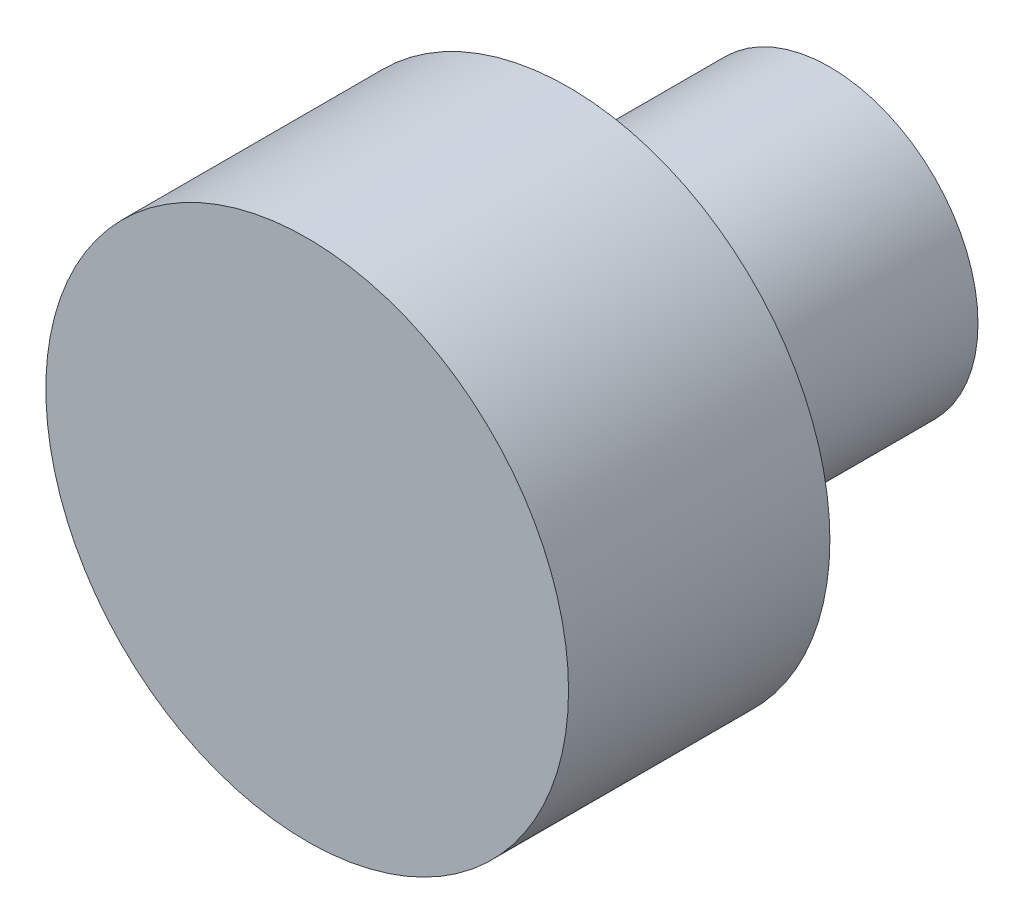
ISO-10303-21;
HEADER;
FILE_DESCRIPTION(('STEP AP214'),'2;1');
FILE_NAME('part.step','',(''),(''),'','','');
FILE_SCHEMA(('AUTOMOTIVE_DESIGN { 1 0 10303 214 1 1 1 1 }'));
ENDSEC;
DATA;
#1=APPLICATION_CONTEXT('core data for automotive mechanical design processes');
#2=APPLICATION_PROTOCOL_DEFINITION('international standard','automotive_design',2000,#1);
#3=PRODUCT_CONTEXT('',#1,'mechanical');
#4=PRODUCT('Part','Part','',(#3));
#5=PRODUCT_RELATED_PRODUCT_CATEGORY('part','',(#4));
#6=PRODUCT_DEFINITION_FORMATION('','',#4);
#7=PRODUCT_DEFINITION_CONTEXT('part definition',#1,'design');
#8=PRODUCT_DEFINITION('design','',#6,#7);
#9=PRODUCT_DEFINITION_SHAPE('','',#8);
#10=(LENGTH_UNIT() NAMED_UNIT(*) SI_UNIT(.MILLI.,.METRE.));
#11=(NAMED_UNIT(*) PLANE_ANGLE_UNIT() SI_UNIT($,.RADIAN.));
#12=(NAMED_UNIT(*) SI_UNIT($,.STERADIAN.) SOLID_ANGLE_UNIT());
#13=UNCERTAINTY_MEASURE_WITH_UNIT(LENGTH_MEASURE(1.E-05),#10,'distance_accuracy_value','');
#14=(GEOMETRIC_REPRESENTATION_CONTEXT(3) GLOBAL_UNCERTAINTY_ASSIGNED_CONTEXT((#13)) GLOBAL_UNIT_ASSIGNED_CONTEXT((#10,
#11,#12)) REPRESENTATION_CONTEXT('',''));
#15=CARTESIAN_POINT('',(0.,0.,0.));
#16=DIRECTION('',(0.,0.,1.));
#17=DIRECTION('',(1.,0.,0.));
#18=AXIS2_PLACEMENT_3D('',#15,#16,#17);
#19=CARTESIAN_POINT('',(0.,0.,6.));
#20=DIRECTION('',(0.,0.,-1.));
#21=DIRECTION('',(-1.,0.,0.));
#22=AXIS2_PLACEMENT_3D('',#19,#20,#21);
#23=CYLINDRICAL_SURFACE('',#22,6.);
#24=CARTESIAN_POINT('',(0.,0.,6.));
#25=DIRECTION('',(0.,0.,1.));
#26=DIRECTION('',(1.,0.,0.));
#27=AXIS2_PLACEMENT_3D('',#24,#25,#26);
#28=CIRCLE('',#27,6.);
#29=CARTESIAN_POINT('',(6.,0.,6.));
#30=VERTEX_POINT('',#29);
#31=EDGE_CURVE('E10',#30,#30,#28,.T.);
#32=ORIENTED_EDGE('',*,*,#31,.F.);
#33=EDGE_LOOP('',(#32));
#34=FACE_BOUND('',#33,.T.);
#35=CARTESIAN_POINT('',(0.,0.,0.));
#36=DIRECTION('',(0.,0.,1.));
#37=DIRECTION('',(1.,0.,0.));
#38=AXIS2_PLACEMENT_3D('',#35,#36,#37);
#39=CIRCLE('',#38,6.);
#40=CARTESIAN_POINT('',(6.,0.,0.));
#41=VERTEX_POINT('',#40);
#42=EDGE_CURVE('E40',#41,#41,#39,.T.);
#43=ORIENTED_EDGE('',*,*,#42,.T.);
#44=EDGE_LOOP('',(#43));
#45=FACE_BOUND('',#44,.T.);
#46=ADVANCED_FACE('F37',(#34,#45),#23,.T.);
#47=CARTESIAN_POINT('',(0.,0.,6.));
#48=DIRECTION('',(0.,0.,1.));
#49=DIRECTION('',(1.,0.,0.));
#50=AXIS2_PLACEMENT_3D('',#47,#48,#49);
#51=PLANE('',#50);
#52=ORIENTED_EDGE('',*,*,#31,.T.);
#53=EDGE_LOOP('',(#52));
#54=FACE_BOUND('',#53,.T.);
#55=ADVANCED_FACE('F67',(#54),#51,.T.);
#56=CARTESIAN_POINT('',(0.,0.,0.));
#57=DIRECTION('',(0.,0.,1.));
#58=DIRECTION('',(1.,0.,0.));
#59=AXIS2_PLACEMENT_3D('',#56,#57,#58);
#60=PLANE('',#59);
#61=CARTESIAN_POINT('',(0.,0.,0.));
#62=DIRECTION('',(0.,0.,1.));
#63=DIRECTION('',(1.,0.,0.));
#64=AXIS2_PLACEMENT_3D('',#61,#62,#63);
#65=CIRCLE('',#64,3.4);
#66=CARTESIAN_POINT('',(3.4,0.,0.));
#67=VERTEX_POINT('',#66);
#68=EDGE_CURVE('E49',#67,#67,#65,.T.);
#69=ORIENTED_EDGE('',*,*,#68,.T.);
#70=EDGE_LOOP('',(#69));
#71=FACE_BOUND('',#70,.T.);
#72=ORIENTED_EDGE('',*,*,#42,.F.);
#73=EDGE_LOOP('',(#72));
#74=FACE_BOUND('',#73,.T.);
#75=ADVANCED_FACE('F64',(#71,#74),#60,.F.);
#76=CARTESIAN_POINT('',(0.,0.,-6.));
#77=DIRECTION('',(0.,0.,1.));
#78=DIRECTION('',(1.,0.,0.));
#79=AXIS2_PLACEMENT_3D('',#76,#77,#78);
#80=CYLINDRICAL_SURFACE('',#79,3.4);
#81=CARTESIAN_POINT('',(0.,0.,-6.));
#82=DIRECTION('',(0.,0.,1.));
#83=DIRECTION('',(1.,0.,0.));
#84=AXIS2_PLACEMENT_3D('',#81,#82,#83);
#85=CIRCLE('',#84,3.4);
#86=CARTESIAN_POINT('',(3.4,0.,-6.));
#87=VERTEX_POINT('',#86);
#88=EDGE_CURVE('E47',#87,#87,#85,.T.);
#89=ORIENTED_EDGE('',*,*,#88,.T.);
#90=EDGE_LOOP('',(#89));
#91=FACE_BOUND('',#90,.T.);
#92=ORIENTED_EDGE('',*,*,#68,.F.);
#93=EDGE_LOOP('',(#92));
#94=FACE_BOUND('',#93,.T.);
#95=ADVANCED_FACE('F55',(#91,#94),#80,.T.);
#96=CARTESIAN_POINT('',(0.,0.,-6.));
#97=DIRECTION('',(0.,0.,1.));
#98=DIRECTION('',(1.,0.,0.));
#99=AXIS2_PLACEMENT_3D('',#96,#97,#98);
#100=PLANE('',#99);
#101=ORIENTED_EDGE('',*,*,#88,.F.);
#102=EDGE_LOOP('',(#101));
#103=FACE_BOUND('',#102,.T.);
#104=ADVANCED_FACE('F58',(#103),#100,.F.);
#105=CLOSED_SHELL('',(#46,#55,#75,#95,#104));
#106=MANIFOLD_SOLID_BREP('B2',#105);
#107=ADVANCED_BREP_SHAPE_REPRESENTATION('',(#18,#106),#14);
#108=SHAPE_DEFINITION_REPRESENTATION(#9,#107);
ENDSEC;
END-ISO-10303-21;
